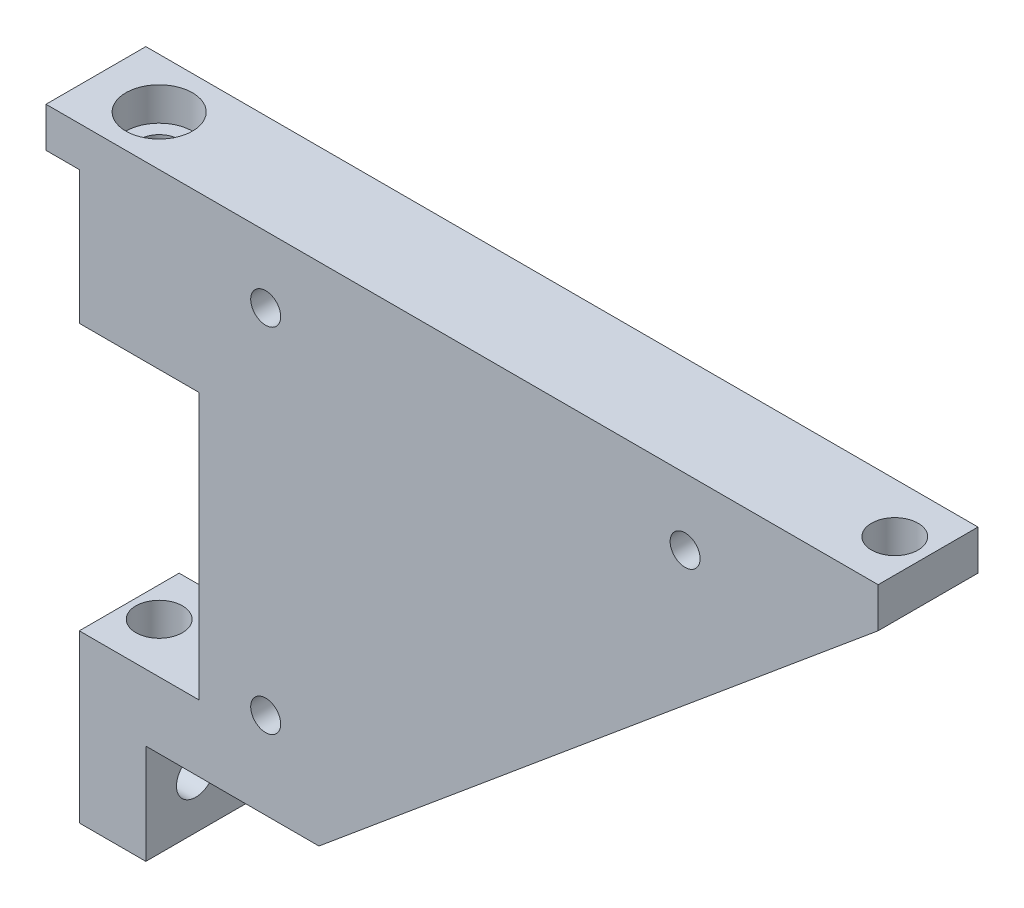
ISO-10303-21;
HEADER;
FILE_DESCRIPTION(('STEP AP214'),'2;1');
FILE_NAME('part.step','',(''),(''),'','','');
FILE_SCHEMA(('AUTOMOTIVE_DESIGN { 1 0 10303 214 1 1 1 1 }'));
ENDSEC;
DATA;
#1=APPLICATION_CONTEXT('core data for automotive mechanical design processes');
#2=APPLICATION_PROTOCOL_DEFINITION('international standard','automotive_design',2000,#1);
#3=PRODUCT_CONTEXT('',#1,'mechanical');
#4=PRODUCT('Part','Part','',(#3));
#5=PRODUCT_RELATED_PRODUCT_CATEGORY('part','',(#4));
#6=PRODUCT_DEFINITION_FORMATION('','',#4);
#7=PRODUCT_DEFINITION_CONTEXT('part definition',#1,'design');
#8=PRODUCT_DEFINITION('design','',#6,#7);
#9=PRODUCT_DEFINITION_SHAPE('','',#8);
#10=(LENGTH_UNIT() NAMED_UNIT(*) SI_UNIT(.MILLI.,.METRE.));
#11=(NAMED_UNIT(*) PLANE_ANGLE_UNIT() SI_UNIT($,.RADIAN.));
#12=(NAMED_UNIT(*) SI_UNIT($,.STERADIAN.) SOLID_ANGLE_UNIT());
#13=UNCERTAINTY_MEASURE_WITH_UNIT(LENGTH_MEASURE(1.E-05),#10,'distance_accuracy_value','');
#14=(GEOMETRIC_REPRESENTATION_CONTEXT(3) GLOBAL_UNCERTAINTY_ASSIGNED_CONTEXT((#13)) GLOBAL_UNIT_ASSIGNED_CONTEXT((#10,
#11,#12)) REPRESENTATION_CONTEXT('',''));
#15=CARTESIAN_POINT('',(0.,0.,0.));
#16=DIRECTION('',(0.,0.,1.));
#17=DIRECTION('',(1.,0.,0.));
#18=AXIS2_PLACEMENT_3D('',#15,#16,#17);
#19=CARTESIAN_POINT('',(0.,0.,7.5));
#20=DIRECTION('',(0.,0.,-1.));
#21=DIRECTION('',(-1.,0.,0.));
#22=AXIS2_PLACEMENT_3D('',#19,#20,#21);
#23=PLANE('',#22);
#24=CARTESIAN_POINT('',(28.,-57.,7.5));
#25=DIRECTION('',(0.,0.,1.));
#26=DIRECTION('',(1.,0.,0.));
#27=AXIS2_PLACEMENT_3D('',#24,#25,#26);
#28=CIRCLE('',#27,2.25);
#29=CARTESIAN_POINT('',(30.25,-57.,7.5));
#30=VERTEX_POINT('',#29);
#31=EDGE_CURVE('E425',#30,#30,#28,.T.);
#32=ORIENTED_EDGE('',*,*,#31,.F.);
#33=EDGE_LOOP('',(#32));
#34=FACE_BOUND('',#33,.T.);
#35=CARTESIAN_POINT('',(91.,-4.,7.5));
#36=DIRECTION('',(0.,0.,1.));
#37=DIRECTION('',(1.,0.,0.));
#38=AXIS2_PLACEMENT_3D('',#35,#36,#37);
#39=CIRCLE('',#38,2.25);
#40=CARTESIAN_POINT('',(93.25,-4.,7.5));
#41=VERTEX_POINT('',#40);
#42=EDGE_CURVE('E417',#41,#41,#39,.T.);
#43=ORIENTED_EDGE('',*,*,#42,.F.);
#44=EDGE_LOOP('',(#43));
#45=FACE_BOUND('',#44,.T.);
#46=DIRECTION('',(0.,-1.,0.));
#47=VECTOR('',#46,1.);
#48=CARTESIAN_POINT('',(0.,-100.,7.5));
#49=LINE('',#48,#47);
#50=CARTESIAN_POINT('',(0.,-60.,7.5));
#51=VERTEX_POINT('',#50);
#52=CARTESIAN_POINT('',(0.,-85.,7.5));
#53=VERTEX_POINT('',#52);
#54=EDGE_CURVE('E296',#51,#53,#49,.T.);
#55=ORIENTED_EDGE('',*,*,#54,.T.);
#56=DIRECTION('',(-1.,0.,0.));
#57=VECTOR('',#56,1.);
#58=CARTESIAN_POINT('',(10.,-85.,7.5));
#59=LINE('',#58,#57);
#60=CARTESIAN_POINT('',(10.,-85.,7.5));
#61=VERTEX_POINT('',#60);
#62=EDGE_CURVE('E233',#61,#53,#59,.T.);
#63=ORIENTED_EDGE('',*,*,#62,.F.);
#64=DIRECTION('',(0.,1.,0.));
#65=VECTOR('',#64,1.);
#66=CARTESIAN_POINT('',(10.,-70.,7.5));
#67=LINE('',#66,#65);
#68=CARTESIAN_POINT('',(10.,-70.,7.5));
#69=VERTEX_POINT('',#68);
#70=EDGE_CURVE('E222',#61,#69,#67,.T.);
#71=ORIENTED_EDGE('',*,*,#70,.T.);
#72=DIRECTION('',(-1.,0.,0.));
#73=VECTOR('',#72,1.);
#74=CARTESIAN_POINT('',(0.,-70.,7.5));
#75=LINE('',#74,#73);
#76=CARTESIAN_POINT('',(36.,-70.,7.5));
#77=VERTEX_POINT('',#76);
#78=EDGE_CURVE('E244',#77,#69,#75,.T.);
#79=ORIENTED_EDGE('',*,*,#78,.F.);
#80=DIRECTION('',(0.768221279597376,0.64018439966448,0.));
#81=VECTOR('',#80,1.);
#82=CARTESIAN_POINT('',(120.,0.,7.5));
#83=LINE('',#82,#81);
#84=CARTESIAN_POINT('',(120.,0.,7.5));
#85=VERTEX_POINT('',#84);
#86=EDGE_CURVE('E300',#77,#85,#83,.T.);
#87=ORIENTED_EDGE('',*,*,#86,.T.);
#88=DIRECTION('',(0.,-1.,0.));
#89=VECTOR('',#88,1.);
#90=CARTESIAN_POINT('',(120.,6.,7.5));
#91=LINE('',#90,#89);
#92=CARTESIAN_POINT('',(120.,6.,7.5));
#93=VERTEX_POINT('',#92);
#94=EDGE_CURVE('E385',#93,#85,#91,.T.);
#95=ORIENTED_EDGE('',*,*,#94,.F.);
#96=DIRECTION('',(1.,0.,0.));
#97=VECTOR('',#96,1.);
#98=CARTESIAN_POINT('',(-5.,6.,7.50000000000002));
#99=LINE('',#98,#97);
#100=CARTESIAN_POINT('',(-5.,6.,7.50000000000002));
#101=VERTEX_POINT('',#100);
#102=EDGE_CURVE('E189',#101,#93,#99,.T.);
#103=ORIENTED_EDGE('',*,*,#102,.F.);
#104=DIRECTION('',(0.,-1.,0.));
#105=VECTOR('',#104,1.);
#106=CARTESIAN_POINT('',(-5.,6.,7.50000000000002));
#107=LINE('',#106,#105);
#108=CARTESIAN_POINT('',(-5.,0.,7.50000000000002));
#109=VERTEX_POINT('',#108);
#110=EDGE_CURVE('E210',#101,#109,#107,.T.);
#111=ORIENTED_EDGE('',*,*,#110,.T.);
#112=DIRECTION('',(1.,0.,0.));
#113=VECTOR('',#112,1.);
#114=CARTESIAN_POINT('',(-5.,0.,7.50000000000002));
#115=LINE('',#114,#113);
#116=CARTESIAN_POINT('',(0.,0.,7.50000000000002));
#117=VERTEX_POINT('',#116);
#118=EDGE_CURVE('E191',#109,#117,#115,.T.);
#119=ORIENTED_EDGE('',*,*,#118,.T.);
#120=CARTESIAN_POINT('',(0.,-20.,7.5));
#121=VERTEX_POINT('',#120);
#122=EDGE_CURVE('E291',#117,#121,#49,.T.);
#123=ORIENTED_EDGE('',*,*,#122,.T.);
#124=DIRECTION('',(-1.,0.,0.));
#125=VECTOR('',#124,1.);
#126=CARTESIAN_POINT('',(0.,-20.,7.5));
#127=LINE('',#126,#125);
#128=CARTESIAN_POINT('',(18.,-20.,7.5));
#129=VERTEX_POINT('',#128);
#130=EDGE_CURVE('E271',#129,#121,#127,.T.);
#131=ORIENTED_EDGE('',*,*,#130,.F.);
#132=DIRECTION('',(0.,1.,0.));
#133=VECTOR('',#132,1.);
#134=CARTESIAN_POINT('',(18.,-20.,7.5));
#135=LINE('',#134,#133);
#136=CARTESIAN_POINT('',(18.,-60.,7.5));
#137=VERTEX_POINT('',#136);
#138=EDGE_CURVE('E266',#137,#129,#135,.T.);
#139=ORIENTED_EDGE('',*,*,#138,.F.);
#140=DIRECTION('',(1.,0.,0.));
#141=VECTOR('',#140,1.);
#142=CARTESIAN_POINT('',(0.,-60.,7.5));
#143=LINE('',#142,#141);
#144=EDGE_CURVE('E267',#51,#137,#143,.T.);
#145=ORIENTED_EDGE('',*,*,#144,.F.);
#146=EDGE_LOOP('',(#55,#63,#71,#79,#87,#95,#103,#111,#119,#123,#131,#139,#145));
#147=FACE_BOUND('',#146,.T.);
#148=CARTESIAN_POINT('',(28.,-4.,7.5));
#149=DIRECTION('',(0.,0.,1.));
#150=DIRECTION('',(1.,0.,0.));
#151=AXIS2_PLACEMENT_3D('',#148,#149,#150);
#152=CIRCLE('',#151,2.25);
#153=CARTESIAN_POINT('',(30.25,-4.,7.5));
#154=VERTEX_POINT('',#153);
#155=EDGE_CURVE('E435',#154,#154,#152,.T.);
#156=ORIENTED_EDGE('',*,*,#155,.F.);
#157=EDGE_LOOP('',(#156));
#158=FACE_BOUND('',#157,.T.);
#159=ADVANCED_FACE('F46',(#34,#45,#147,#158),#23,.F.);
#160=CARTESIAN_POINT('',(10.,0.,0.));
#161=DIRECTION('',(-1.,0.,0.));
#162=DIRECTION('',(0.,0.,1.));
#163=AXIS2_PLACEMENT_3D('',#160,#161,#162);
#164=PLANE('',#163);
#165=DIRECTION('',(0.,-1.,0.));
#166=VECTOR('',#165,1.);
#167=CARTESIAN_POINT('',(10.,-70.,-7.5));
#168=LINE('',#167,#166);
#169=CARTESIAN_POINT('',(10.,-70.,-7.5));
#170=VERTEX_POINT('',#169);
#171=CARTESIAN_POINT('',(10.,-85.,-7.5));
#172=VERTEX_POINT('',#171);
#173=EDGE_CURVE('E62',#170,#172,#168,.T.);
#174=ORIENTED_EDGE('',*,*,#173,.F.);
#175=DIRECTION('',(0.,0.,-1.));
#176=VECTOR('',#175,1.);
#177=CARTESIAN_POINT('',(10.,-70.,-7.5));
#178=LINE('',#177,#176);
#179=EDGE_CURVE('E221',#69,#170,#178,.T.);
#180=ORIENTED_EDGE('',*,*,#179,.F.);
#181=ORIENTED_EDGE('',*,*,#70,.F.);
#182=DIRECTION('',(0.,0.,1.));
#183=VECTOR('',#182,1.);
#184=CARTESIAN_POINT('',(10.,-85.,-7.5));
#185=LINE('',#184,#183);
#186=EDGE_CURVE('E220',#172,#61,#185,.T.);
#187=ORIENTED_EDGE('',*,*,#186,.F.);
#188=EDGE_LOOP('',(#174,#180,#181,#187));
#189=FACE_BOUND('',#188,.T.);
#190=CARTESIAN_POINT('',(10.,-77.5,0.));
#191=DIRECTION('',(1.,0.,0.));
#192=DIRECTION('',(0.,0.,-1.));
#193=AXIS2_PLACEMENT_3D('',#190,#191,#192);
#194=CIRCLE('',#193,2.9);
#195=CARTESIAN_POINT('',(10.,-77.5,-2.9));
#196=VERTEX_POINT('',#195);
#197=EDGE_CURVE('E196',#196,#196,#194,.T.);
#198=ORIENTED_EDGE('',*,*,#197,.F.);
#199=EDGE_LOOP('',(#198));
#200=FACE_BOUND('',#199,.T.);
#201=ADVANCED_FACE('F336',(#189,#200),#164,.F.);
#202=CARTESIAN_POINT('',(0.,-100.,7.5));
#203=DIRECTION('',(1.,0.,0.));
#204=DIRECTION('',(0.,0.,-1.));
#205=AXIS2_PLACEMENT_3D('',#202,#203,#204);
#206=PLANE('',#205);
#207=DIRECTION('',(0.,-1.,0.));
#208=VECTOR('',#207,1.);
#209=CARTESIAN_POINT('',(0.,-100.,-7.5));
#210=LINE('',#209,#208);
#211=CARTESIAN_POINT('',(0.,0.,-7.49999999999999));
#212=VERTEX_POINT('',#211);
#213=CARTESIAN_POINT('',(0.,-20.,-7.5));
#214=VERTEX_POINT('',#213);
#215=EDGE_CURVE('E305',#212,#214,#210,.T.);
#216=ORIENTED_EDGE('',*,*,#215,.T.);
#217=DIRECTION('',(0.,0.,1.));
#218=VECTOR('',#217,1.);
#219=CARTESIAN_POINT('',(0.,-20.,-7.501));
#220=LINE('',#219,#218);
#221=EDGE_CURVE('E276',#214,#121,#220,.T.);
#222=ORIENTED_EDGE('',*,*,#221,.T.);
#223=ORIENTED_EDGE('',*,*,#122,.F.);
#224=DIRECTION('',(0.,0.,-1.));
#225=VECTOR('',#224,1.);
#226=CARTESIAN_POINT('',(0.,0.,7.5));
#227=LINE('',#226,#225);
#228=EDGE_CURVE('E301',#117,#212,#227,.T.);
#229=ORIENTED_EDGE('',*,*,#228,.T.);
#230=EDGE_LOOP('',(#216,#222,#223,#229));
#231=FACE_BOUND('',#230,.T.);
#232=ADVANCED_FACE('F342',(#231),#206,.F.);
#233=CARTESIAN_POINT('',(0.,-77.5,0.));
#234=DIRECTION('',(1.,0.,0.));
#235=DIRECTION('',(0.,0.,-1.));
#236=AXIS2_PLACEMENT_3D('',#233,#234,#235);
#237=CIRCLE('',#236,2.9);
#238=CARTESIAN_POINT('',(0.,-77.5,-2.9));
#239=VERTEX_POINT('',#238);
#240=EDGE_CURVE('E201',#239,#239,#237,.T.);
#241=ORIENTED_EDGE('',*,*,#240,.T.);
#242=EDGE_LOOP('',(#241));
#243=FACE_BOUND('',#242,.T.);
#244=CARTESIAN_POINT('',(0.,-60.,-7.5));
#245=VERTEX_POINT('',#244);
#246=CARTESIAN_POINT('',(0.,-85.,-7.5));
#247=VERTEX_POINT('',#246);
#248=EDGE_CURVE('E292',#245,#247,#210,.T.);
#249=ORIENTED_EDGE('',*,*,#248,.T.);
#250=DIRECTION('',(0.,0.,1.));
#251=VECTOR('',#250,1.);
#252=CARTESIAN_POINT('',(0.,-85.,-7.5));
#253=LINE('',#252,#251);
#254=EDGE_CURVE('E213',#247,#53,#253,.T.);
#255=ORIENTED_EDGE('',*,*,#254,.T.);
#256=ORIENTED_EDGE('',*,*,#54,.F.);
#257=DIRECTION('',(0.,0.,1.));
#258=VECTOR('',#257,1.);
#259=CARTESIAN_POINT('',(0.,-60.,-7.501));
#260=LINE('',#259,#258);
#261=EDGE_CURVE('E279',#245,#51,#260,.T.);
#262=ORIENTED_EDGE('',*,*,#261,.F.);
#263=EDGE_LOOP('',(#249,#255,#256,#262));
#264=FACE_BOUND('',#263,.T.);
#265=ADVANCED_FACE('F358',(#243,#264),#206,.F.);
#266=CARTESIAN_POINT('',(120.,0.,7.5));
#267=DIRECTION('',(-0.64018439966448,0.768221279597376,0.));
#268=DIRECTION('',(-0.768221279597376,-0.64018439966448,0.));
#269=AXIS2_PLACEMENT_3D('',#266,#267,#268);
#270=PLANE('',#269);
#271=CARTESIAN_POINT('',(115.,-4.16666666666669,0.));
#272=DIRECTION('',(-0.64018439966448,0.768221279597376,0.));
#273=DIRECTION('',(0.768221279597376,0.64018439966448,0.));
#274=AXIS2_PLACEMENT_3D('',#271,#272,#273);
#275=ELLIPSE('',#274,4.5559789776122,3.49999999999999);
#276=CARTESIAN_POINT('',(118.5,-1.25000000000004,0.));
#277=VERTEX_POINT('',#276);
#278=EDGE_CURVE('E232',#277,#277,#275,.T.);
#279=ORIENTED_EDGE('',*,*,#278,.T.);
#280=EDGE_LOOP('',(#279));
#281=FACE_BOUND('',#280,.T.);
#282=ORIENTED_EDGE('',*,*,#86,.F.);
#283=DIRECTION('',(0.,0.,1.));
#284=VECTOR('',#283,1.);
#285=CARTESIAN_POINT('',(36.,-70.,-7.501));
#286=LINE('',#285,#284);
#287=CARTESIAN_POINT('',(36.,-70.,-7.5));
#288=VERTEX_POINT('',#287);
#289=EDGE_CURVE('E248',#288,#77,#286,.T.);
#290=ORIENTED_EDGE('',*,*,#289,.F.);
#291=DIRECTION('',(0.768221279597376,0.64018439966448,0.));
#292=VECTOR('',#291,1.);
#293=CARTESIAN_POINT('',(120.,0.,-7.5));
#294=LINE('',#293,#292);
#295=CARTESIAN_POINT('',(120.,0.,-7.5));
#296=VERTEX_POINT('',#295);
#297=EDGE_CURVE('E306',#288,#296,#294,.T.);
#298=ORIENTED_EDGE('',*,*,#297,.T.);
#299=DIRECTION('',(0.,0.,-1.));
#300=VECTOR('',#299,1.);
#301=CARTESIAN_POINT('',(120.,0.,7.5));
#302=LINE('',#301,#300);
#303=EDGE_CURVE('E54',#85,#296,#302,.T.);
#304=ORIENTED_EDGE('',*,*,#303,.F.);
#305=EDGE_LOOP('',(#282,#290,#298,#304));
#306=FACE_BOUND('',#305,.T.);
#307=ADVANCED_FACE('F355',(#281,#306),#270,.F.);
#308=CARTESIAN_POINT('',(0.,0.,-7.5));
#309=DIRECTION('',(0.,0.,-1.));
#310=DIRECTION('',(-1.,0.,0.));
#311=AXIS2_PLACEMENT_3D('',#308,#309,#310);
#312=PLANE('',#311);
#313=CARTESIAN_POINT('',(28.,-4.,-7.5));
#314=DIRECTION('',(0.,0.,-1.));
#315=DIRECTION('',(-1.,0.,0.));
#316=AXIS2_PLACEMENT_3D('',#313,#314,#315);
#317=CIRCLE('',#316,2.25);
#318=CARTESIAN_POINT('',(25.75,-4.,-7.5));
#319=VERTEX_POINT('',#318);
#320=EDGE_CURVE('E426',#319,#319,#317,.T.);
#321=ORIENTED_EDGE('',*,*,#320,.F.);
#322=EDGE_LOOP('',(#321));
#323=FACE_BOUND('',#322,.T.);
#324=CARTESIAN_POINT('',(28.,-57.,-7.5));
#325=DIRECTION('',(0.,0.,-1.));
#326=DIRECTION('',(-1.,0.,0.));
#327=AXIS2_PLACEMENT_3D('',#324,#325,#326);
#328=CIRCLE('',#327,2.25);
#329=CARTESIAN_POINT('',(25.75,-57.,-7.5));
#330=VERTEX_POINT('',#329);
#331=EDGE_CURVE('E418',#330,#330,#328,.T.);
#332=ORIENTED_EDGE('',*,*,#331,.F.);
#333=EDGE_LOOP('',(#332));
#334=FACE_BOUND('',#333,.T.);
#335=CARTESIAN_POINT('',(91.,-4.,-7.5));
#336=DIRECTION('',(0.,0.,-1.));
#337=DIRECTION('',(-1.,0.,0.));
#338=AXIS2_PLACEMENT_3D('',#335,#336,#337);
#339=CIRCLE('',#338,2.25);
#340=CARTESIAN_POINT('',(88.75,-4.,-7.5));
#341=VERTEX_POINT('',#340);
#342=EDGE_CURVE('E411',#341,#341,#339,.T.);
#343=ORIENTED_EDGE('',*,*,#342,.F.);
#344=EDGE_LOOP('',(#343));
#345=FACE_BOUND('',#344,.T.);
#346=DIRECTION('',(-1.,0.,0.));
#347=VECTOR('',#346,1.);
#348=CARTESIAN_POINT('',(0.,-70.,-7.5));
#349=LINE('',#348,#347);
#350=EDGE_CURVE('E245',#288,#170,#349,.T.);
#351=ORIENTED_EDGE('',*,*,#350,.T.);
#352=ORIENTED_EDGE('',*,*,#173,.T.);
#353=DIRECTION('',(-1.,0.,0.));
#354=VECTOR('',#353,1.);
#355=CARTESIAN_POINT('',(10.,-85.,-7.5));
#356=LINE('',#355,#354);
#357=EDGE_CURVE('E227',#172,#247,#356,.T.);
#358=ORIENTED_EDGE('',*,*,#357,.T.);
#359=ORIENTED_EDGE('',*,*,#248,.F.);
#360=DIRECTION('',(1.,0.,0.));
#361=VECTOR('',#360,1.);
#362=CARTESIAN_POINT('',(0.,-60.,-7.5));
#363=LINE('',#362,#361);
#364=CARTESIAN_POINT('',(18.,-60.,-7.5));
#365=VERTEX_POINT('',#364);
#366=EDGE_CURVE('E283',#245,#365,#363,.T.);
#367=ORIENTED_EDGE('',*,*,#366,.T.);
#368=DIRECTION('',(0.,1.,0.));
#369=VECTOR('',#368,1.);
#370=CARTESIAN_POINT('',(18.,-20.,-7.5));
#371=LINE('',#370,#369);
#372=CARTESIAN_POINT('',(18.,-20.,-7.5));
#373=VERTEX_POINT('',#372);
#374=EDGE_CURVE('E256',#365,#373,#371,.T.);
#375=ORIENTED_EDGE('',*,*,#374,.T.);
#376=DIRECTION('',(-1.,0.,0.));
#377=VECTOR('',#376,1.);
#378=CARTESIAN_POINT('',(0.,-20.,-7.5));
#379=LINE('',#378,#377);
#380=EDGE_CURVE('E265',#373,#214,#379,.T.);
#381=ORIENTED_EDGE('',*,*,#380,.T.);
#382=ORIENTED_EDGE('',*,*,#215,.F.);
#383=DIRECTION('',(-1.,0.,0.));
#384=VECTOR('',#383,1.);
#385=CARTESIAN_POINT('',(120.,0.,-7.5));
#386=LINE('',#385,#384);
#387=CARTESIAN_POINT('',(-5.,0.,-7.49999999999999));
#388=VERTEX_POINT('',#387);
#389=EDGE_CURVE('E399',#212,#388,#386,.T.);
#390=ORIENTED_EDGE('',*,*,#389,.T.);
#391=DIRECTION('',(0.,-1.,0.));
#392=VECTOR('',#391,1.);
#393=CARTESIAN_POINT('',(-5.,6.,-7.49999999999999));
#394=LINE('',#393,#392);
#395=CARTESIAN_POINT('',(-5.,6.,-7.49999999999999));
#396=VERTEX_POINT('',#395);
#397=EDGE_CURVE('E180',#396,#388,#394,.T.);
#398=ORIENTED_EDGE('',*,*,#397,.F.);
#399=DIRECTION('',(-1.,0.,0.));
#400=VECTOR('',#399,1.);
#401=CARTESIAN_POINT('',(120.,6.,-7.5));
#402=LINE('',#401,#400);
#403=CARTESIAN_POINT('',(120.,6.,-7.5));
#404=VERTEX_POINT('',#403);
#405=EDGE_CURVE('E166',#404,#396,#402,.T.);
#406=ORIENTED_EDGE('',*,*,#405,.F.);
#407=DIRECTION('',(0.,-1.,0.));
#408=VECTOR('',#407,1.);
#409=CARTESIAN_POINT('',(120.,6.,-7.5));
#410=LINE('',#409,#408);
#411=EDGE_CURVE('E172',#404,#296,#410,.T.);
#412=ORIENTED_EDGE('',*,*,#411,.T.);
#413=ORIENTED_EDGE('',*,*,#297,.F.);
#414=EDGE_LOOP('',(#351,#352,#358,#359,#367,#375,#381,#382,#390,#398,#406,#412,#413));
#415=FACE_BOUND('',#414,.T.);
#416=ADVANCED_FACE('F171',(#323,#334,#345,#415),#312,.T.);
#417=CARTESIAN_POINT('',(0.,-20.,-7.501));
#418=DIRECTION('',(0.,1.,0.));
#419=DIRECTION('',(0.,0.,1.));
#420=AXIS2_PLACEMENT_3D('',#417,#418,#419);
#421=PLANE('',#420);
#422=CARTESIAN_POINT('',(4.5,-20.,0.));
#423=DIRECTION('',(0.,1.,0.));
#424=DIRECTION('',(0.,0.,1.));
#425=AXIS2_PLACEMENT_3D('',#422,#423,#424);
#426=CIRCLE('',#425,2.89999999999998);
#427=CARTESIAN_POINT('',(4.5,-20.,2.89999999999998));
#428=VERTEX_POINT('',#427);
#429=EDGE_CURVE('E254',#428,#428,#426,.T.);
#430=ORIENTED_EDGE('',*,*,#429,.T.);
#431=EDGE_LOOP('',(#430));
#432=FACE_BOUND('',#431,.T.);
#433=DIRECTION('',(0.,0.,1.));
#434=VECTOR('',#433,1.);
#435=CARTESIAN_POINT('',(18.,-20.,-7.501));
#436=LINE('',#435,#434);
#437=EDGE_CURVE('E285',#373,#129,#436,.T.);
#438=ORIENTED_EDGE('',*,*,#437,.T.);
#439=ORIENTED_EDGE('',*,*,#130,.T.);
#440=ORIENTED_EDGE('',*,*,#221,.F.);
#441=ORIENTED_EDGE('',*,*,#380,.F.);
#442=EDGE_LOOP('',(#438,#439,#440,#441));
#443=FACE_BOUND('',#442,.T.);
#444=ADVANCED_FACE('F354',(#432,#443),#421,.F.);
#445=CARTESIAN_POINT('',(18.,-20.,-7.501));
#446=DIRECTION('',(1.,0.,0.));
#447=DIRECTION('',(0.,1.,0.));
#448=AXIS2_PLACEMENT_3D('',#445,#446,#447);
#449=PLANE('',#448);
#450=DIRECTION('',(0.,0.,1.));
#451=VECTOR('',#450,1.);
#452=CARTESIAN_POINT('',(18.,-60.,-7.501));
#453=LINE('',#452,#451);
#454=EDGE_CURVE('E71',#365,#137,#453,.T.);
#455=ORIENTED_EDGE('',*,*,#454,.T.);
#456=ORIENTED_EDGE('',*,*,#138,.T.);
#457=ORIENTED_EDGE('',*,*,#437,.F.);
#458=ORIENTED_EDGE('',*,*,#374,.F.);
#459=EDGE_LOOP('',(#455,#456,#457,#458));
#460=FACE_BOUND('',#459,.T.);
#461=ADVANCED_FACE('F331',(#460),#449,.F.);
#462=CARTESIAN_POINT('',(0.,-60.,-7.501));
#463=DIRECTION('',(0.,-1.,0.));
#464=DIRECTION('',(1.,0.,0.));
#465=AXIS2_PLACEMENT_3D('',#462,#463,#464);
#466=PLANE('',#465);
#467=CARTESIAN_POINT('',(4.5,-60.,0.));
#468=DIRECTION('',(0.,-1.,0.));
#469=DIRECTION('',(1.,0.,0.));
#470=AXIS2_PLACEMENT_3D('',#467,#468,#469);
#471=CIRCLE('',#470,3.49999999999998);
#472=CARTESIAN_POINT('',(7.99999999999998,-60.,0.));
#473=VERTEX_POINT('',#472);
#474=EDGE_CURVE('E260',#473,#473,#471,.T.);
#475=ORIENTED_EDGE('',*,*,#474,.T.);
#476=EDGE_LOOP('',(#475));
#477=FACE_BOUND('',#476,.T.);
#478=ORIENTED_EDGE('',*,*,#261,.T.);
#479=ORIENTED_EDGE('',*,*,#144,.T.);
#480=ORIENTED_EDGE('',*,*,#454,.F.);
#481=ORIENTED_EDGE('',*,*,#366,.F.);
#482=EDGE_LOOP('',(#478,#479,#480,#481));
#483=FACE_BOUND('',#482,.T.);
#484=ADVANCED_FACE('F324',(#477,#483),#466,.F.);
#485=CARTESIAN_POINT('',(4.5,0.,0.));
#486=DIRECTION('',(0.,1.,0.));
#487=DIRECTION('',(0.,0.,1.));
#488=AXIS2_PLACEMENT_3D('',#485,#486,#487);
#489=CYLINDRICAL_SURFACE('',#488,3.49999999999998);
#490=CARTESIAN_POINT('',(4.5,-70.,0.));
#491=DIRECTION('',(0.,1.,0.));
#492=DIRECTION('',(0.,0.,1.));
#493=AXIS2_PLACEMENT_3D('',#490,#491,#492);
#494=CIRCLE('',#493,3.49999999999998);
#495=CARTESIAN_POINT('',(4.5,-70.,3.49999999999998));
#496=VERTEX_POINT('',#495);
#497=EDGE_CURVE('E255',#496,#496,#494,.T.);
#498=ORIENTED_EDGE('',*,*,#497,.F.);
#499=EDGE_LOOP('',(#498));
#500=FACE_BOUND('',#499,.T.);
#501=ORIENTED_EDGE('',*,*,#474,.F.);
#502=EDGE_LOOP('',(#501));
#503=FACE_BOUND('',#502,.T.);
#504=ADVANCED_FACE('F48',(#500,#503),#489,.F.);
#505=CARTESIAN_POINT('',(4.5,0.,0.));
#506=DIRECTION('',(0.,1.,0.));
#507=DIRECTION('',(0.,0.,1.));
#508=AXIS2_PLACEMENT_3D('',#505,#506,#507);
#509=CYLINDRICAL_SURFACE('',#508,2.89999999999998);
#510=ORIENTED_EDGE('',*,*,#429,.F.);
#511=EDGE_LOOP('',(#510));
#512=FACE_BOUND('',#511,.T.);
#513=CARTESIAN_POINT('',(4.5,1.,0.));
#514=DIRECTION('',(0.,1.,0.));
#515=DIRECTION('',(0.,0.,1.));
#516=AXIS2_PLACEMENT_3D('',#513,#514,#515);
#517=CIRCLE('',#516,2.89999999999999);
#518=CARTESIAN_POINT('',(4.5,1.,2.89999999999999));
#519=VERTEX_POINT('',#518);
#520=EDGE_CURVE('E408',#519,#519,#517,.T.);
#521=ORIENTED_EDGE('',*,*,#520,.T.);
#522=EDGE_LOOP('',(#521));
#523=FACE_BOUND('',#522,.T.);
#524=ADVANCED_FACE('F323',(#512,#523),#509,.F.);
#525=CARTESIAN_POINT('',(0.,-70.,-7.501));
#526=DIRECTION('',(0.,1.,0.));
#527=DIRECTION('',(0.,0.,1.));
#528=AXIS2_PLACEMENT_3D('',#525,#526,#527);
#529=PLANE('',#528);
#530=ORIENTED_EDGE('',*,*,#78,.T.);
#531=ORIENTED_EDGE('',*,*,#179,.T.);
#532=ORIENTED_EDGE('',*,*,#350,.F.);
#533=ORIENTED_EDGE('',*,*,#289,.T.);
#534=EDGE_LOOP('',(#530,#531,#532,#533));
#535=FACE_BOUND('',#534,.T.);
#536=ADVANCED_FACE('F332',(#535),#529,.F.);
#537=CARTESIAN_POINT('',(115.,0.,0.));
#538=DIRECTION('',(0.,1.,0.));
#539=DIRECTION('',(0.,0.,1.));
#540=AXIS2_PLACEMENT_3D('',#537,#538,#539);
#541=CYLINDRICAL_SURFACE('',#540,3.49999999999999);
#542=ORIENTED_EDGE('',*,*,#278,.F.);
#543=EDGE_LOOP('',(#542));
#544=FACE_BOUND('',#543,.T.);
#545=CARTESIAN_POINT('',(115.,6.,0.));
#546=DIRECTION('',(0.,1.,0.));
#547=DIRECTION('',(0.,0.,1.));
#548=AXIS2_PLACEMENT_3D('',#545,#546,#547);
#549=CIRCLE('',#548,3.49999999999999);
#550=CARTESIAN_POINT('',(115.,6.,3.49999999999999));
#551=VERTEX_POINT('',#550);
#552=EDGE_CURVE('E409',#551,#551,#549,.T.);
#553=ORIENTED_EDGE('',*,*,#552,.T.);
#554=EDGE_LOOP('',(#553));
#555=FACE_BOUND('',#554,.T.);
#556=ADVANCED_FACE('F490',(#544,#555),#541,.F.);
#557=CARTESIAN_POINT('',(10.,-85.,-7.5));
#558=DIRECTION('',(0.,-1.,0.));
#559=DIRECTION('',(0.,0.,-1.));
#560=AXIS2_PLACEMENT_3D('',#557,#558,#559);
#561=PLANE('',#560);
#562=ORIENTED_EDGE('',*,*,#254,.F.);
#563=ORIENTED_EDGE('',*,*,#357,.F.);
#564=ORIENTED_EDGE('',*,*,#186,.T.);
#565=ORIENTED_EDGE('',*,*,#62,.T.);
#566=EDGE_LOOP('',(#562,#563,#564,#565));
#567=FACE_BOUND('',#566,.T.);
#568=ADVANCED_FACE('F371',(#567),#561,.T.);
#569=CARTESIAN_POINT('',(10.,-70.,-7.5));
#570=DIRECTION('',(0.,1.,0.));
#571=DIRECTION('',(0.,0.,1.));
#572=AXIS2_PLACEMENT_3D('',#569,#570,#571);
#573=PLANE('',#572);
#574=ORIENTED_EDGE('',*,*,#497,.T.);
#575=EDGE_LOOP('',(#574));
#576=FACE_BOUND('',#575,.T.);
#577=ADVANCED_FACE('F482',(#576),#573,.T.);
#578=CARTESIAN_POINT('',(10.,-77.5,0.));
#579=DIRECTION('',(1.,0.,0.));
#580=DIRECTION('',(0.,0.,-1.));
#581=AXIS2_PLACEMENT_3D('',#578,#579,#580);
#582=CYLINDRICAL_SURFACE('',#581,2.9);
#583=ORIENTED_EDGE('',*,*,#240,.F.);
#584=EDGE_LOOP('',(#583));
#585=FACE_BOUND('',#584,.T.);
#586=ORIENTED_EDGE('',*,*,#197,.T.);
#587=EDGE_LOOP('',(#586));
#588=FACE_BOUND('',#587,.T.);
#589=ADVANCED_FACE('F474',(#585,#588),#582,.F.);
#590=CARTESIAN_POINT('',(0.,6.,0.));
#591=DIRECTION('',(0.,1.,0.));
#592=DIRECTION('',(0.,0.,1.));
#593=AXIS2_PLACEMENT_3D('',#590,#591,#592);
#594=PLANE('',#593);
#595=CARTESIAN_POINT('',(4.5,6.,0.));
#596=DIRECTION('',(0.,1.,0.));
#597=DIRECTION('',(0.,0.,1.));
#598=AXIS2_PLACEMENT_3D('',#595,#596,#597);
#599=CIRCLE('',#598,5.);
#600=CARTESIAN_POINT('',(4.5,6.,5.));
#601=VERTEX_POINT('',#600);
#602=EDGE_CURVE('E396',#601,#601,#599,.T.);
#603=ORIENTED_EDGE('',*,*,#602,.F.);
#604=EDGE_LOOP('',(#603));
#605=FACE_BOUND('',#604,.T.);
#606=DIRECTION('',(0.,0.,-1.));
#607=VECTOR('',#606,1.);
#608=CARTESIAN_POINT('',(120.,6.,7.5));
#609=LINE('',#608,#607);
#610=EDGE_CURVE('E185',#93,#404,#609,.T.);
#611=ORIENTED_EDGE('',*,*,#610,.T.);
#612=ORIENTED_EDGE('',*,*,#405,.T.);
#613=DIRECTION('',(0.,0.,1.));
#614=VECTOR('',#613,1.);
#615=CARTESIAN_POINT('',(-5.,6.,-7.49999999999999));
#616=LINE('',#615,#614);
#617=EDGE_CURVE('E181',#396,#101,#616,.T.);
#618=ORIENTED_EDGE('',*,*,#617,.T.);
#619=ORIENTED_EDGE('',*,*,#102,.T.);
#620=EDGE_LOOP('',(#611,#612,#618,#619));
#621=FACE_BOUND('',#620,.T.);
#622=ORIENTED_EDGE('',*,*,#552,.F.);
#623=EDGE_LOOP('',(#622));
#624=FACE_BOUND('',#623,.T.);
#625=ADVANCED_FACE('F184',(#605,#621,#624),#594,.T.);
#626=CARTESIAN_POINT('',(0.,0.,0.));
#627=DIRECTION('',(0.,1.,0.));
#628=DIRECTION('',(0.,0.,1.));
#629=AXIS2_PLACEMENT_3D('',#626,#627,#628);
#630=PLANE('',#629);
#631=ORIENTED_EDGE('',*,*,#228,.F.);
#632=ORIENTED_EDGE('',*,*,#118,.F.);
#633=DIRECTION('',(0.,0.,1.));
#634=VECTOR('',#633,1.);
#635=CARTESIAN_POINT('',(-5.,0.,-7.49999999999999));
#636=LINE('',#635,#634);
#637=EDGE_CURVE('E394',#388,#109,#636,.T.);
#638=ORIENTED_EDGE('',*,*,#637,.F.);
#639=ORIENTED_EDGE('',*,*,#389,.F.);
#640=EDGE_LOOP('',(#631,#632,#638,#639));
#641=FACE_BOUND('',#640,.T.);
#642=ADVANCED_FACE('F468',(#641),#630,.F.);
#643=CARTESIAN_POINT('',(120.,6.,7.5));
#644=DIRECTION('',(-1.,0.,0.));
#645=DIRECTION('',(0.,0.,1.));
#646=AXIS2_PLACEMENT_3D('',#643,#644,#645);
#647=PLANE('',#646);
#648=ORIENTED_EDGE('',*,*,#303,.T.);
#649=ORIENTED_EDGE('',*,*,#411,.F.);
#650=ORIENTED_EDGE('',*,*,#610,.F.);
#651=ORIENTED_EDGE('',*,*,#94,.T.);
#652=EDGE_LOOP('',(#648,#649,#650,#651));
#653=FACE_BOUND('',#652,.T.);
#654=ADVANCED_FACE('F193',(#653),#647,.F.);
#655=CARTESIAN_POINT('',(-5.,6.,-7.49999999999999));
#656=DIRECTION('',(1.,0.,0.));
#657=DIRECTION('',(0.,0.,-1.));
#658=AXIS2_PLACEMENT_3D('',#655,#656,#657);
#659=PLANE('',#658);
#660=ORIENTED_EDGE('',*,*,#637,.T.);
#661=ORIENTED_EDGE('',*,*,#110,.F.);
#662=ORIENTED_EDGE('',*,*,#617,.F.);
#663=ORIENTED_EDGE('',*,*,#397,.T.);
#664=EDGE_LOOP('',(#660,#661,#662,#663));
#665=FACE_BOUND('',#664,.T.);
#666=ADVANCED_FACE('F467',(#665),#659,.F.);
#667=CARTESIAN_POINT('',(4.5,6.,0.));
#668=DIRECTION('',(0.,-1.,0.));
#669=DIRECTION('',(0.,0.,-1.));
#670=AXIS2_PLACEMENT_3D('',#667,#668,#669);
#671=CYLINDRICAL_SURFACE('',#670,5.);
#672=CARTESIAN_POINT('',(4.5,1.,0.));
#673=DIRECTION('',(0.,1.,0.));
#674=DIRECTION('',(0.,0.,1.));
#675=AXIS2_PLACEMENT_3D('',#672,#673,#674);
#676=CIRCLE('',#675,5.);
#677=CARTESIAN_POINT('',(4.5,1.,5.));
#678=VERTEX_POINT('',#677);
#679=EDGE_CURVE('E12',#678,#678,#676,.T.);
#680=ORIENTED_EDGE('',*,*,#679,.F.);
#681=EDGE_LOOP('',(#680));
#682=FACE_BOUND('',#681,.T.);
#683=ORIENTED_EDGE('',*,*,#602,.T.);
#684=EDGE_LOOP('',(#683));
#685=FACE_BOUND('',#684,.T.);
#686=ADVANCED_FACE('F457',(#682,#685),#671,.F.);
#687=CARTESIAN_POINT('',(4.5,1.,0.));
#688=DIRECTION('',(0.,1.,0.));
#689=DIRECTION('',(0.,0.,1.));
#690=AXIS2_PLACEMENT_3D('',#687,#688,#689);
#691=PLANE('',#690);
#692=ORIENTED_EDGE('',*,*,#679,.T.);
#693=EDGE_LOOP('',(#692));
#694=FACE_BOUND('',#693,.T.);
#695=ORIENTED_EDGE('',*,*,#520,.F.);
#696=EDGE_LOOP('',(#695));
#697=FACE_BOUND('',#696,.T.);
#698=ADVANCED_FACE('F448',(#694,#697),#691,.T.);
#699=CARTESIAN_POINT('',(91.,-4.,7.5));
#700=DIRECTION('',(0.,0.,1.));
#701=DIRECTION('',(1.,0.,0.));
#702=AXIS2_PLACEMENT_3D('',#699,#700,#701);
#703=CYLINDRICAL_SURFACE('',#702,2.25);
#704=ORIENTED_EDGE('',*,*,#42,.T.);
#705=EDGE_LOOP('',(#704));
#706=FACE_BOUND('',#705,.T.);
#707=ORIENTED_EDGE('',*,*,#342,.T.);
#708=EDGE_LOOP('',(#707));
#709=FACE_BOUND('',#708,.T.);
#710=ADVANCED_FACE('F449',(#706,#709),#703,.F.);
#711=CARTESIAN_POINT('',(28.,-57.,7.5));
#712=DIRECTION('',(0.,0.,1.));
#713=DIRECTION('',(1.,0.,0.));
#714=AXIS2_PLACEMENT_3D('',#711,#712,#713);
#715=CYLINDRICAL_SURFACE('',#714,2.25);
#716=ORIENTED_EDGE('',*,*,#31,.T.);
#717=EDGE_LOOP('',(#716));
#718=FACE_BOUND('',#717,.T.);
#719=ORIENTED_EDGE('',*,*,#331,.T.);
#720=EDGE_LOOP('',(#719));
#721=FACE_BOUND('',#720,.T.);
#722=ADVANCED_FACE('F439',(#718,#721),#715,.F.);
#723=CARTESIAN_POINT('',(28.,-4.,7.5));
#724=DIRECTION('',(0.,0.,1.));
#725=DIRECTION('',(1.,0.,0.));
#726=AXIS2_PLACEMENT_3D('',#723,#724,#725);
#727=CYLINDRICAL_SURFACE('',#726,2.25);
#728=ORIENTED_EDGE('',*,*,#155,.T.);
#729=EDGE_LOOP('',(#728));
#730=FACE_BOUND('',#729,.T.);
#731=ORIENTED_EDGE('',*,*,#320,.T.);
#732=EDGE_LOOP('',(#731));
#733=FACE_BOUND('',#732,.T.);
#734=ADVANCED_FACE('F440',(#730,#733),#727,.F.);
#735=CLOSED_SHELL('',(#159,#201,#232,#265,#307,#416,#444,#461,#484,#504,#524,#536,#556,#568,
#577,#589,#625,#642,#654,#666,#686,#698,#710,#722,#734));
#736=MANIFOLD_SOLID_BREP('B2',#735);
#737=ADVANCED_BREP_SHAPE_REPRESENTATION('',(#18,#736),#14);
#738=SHAPE_DEFINITION_REPRESENTATION(#9,#737);
ENDSEC;
END-ISO-10303-21;
